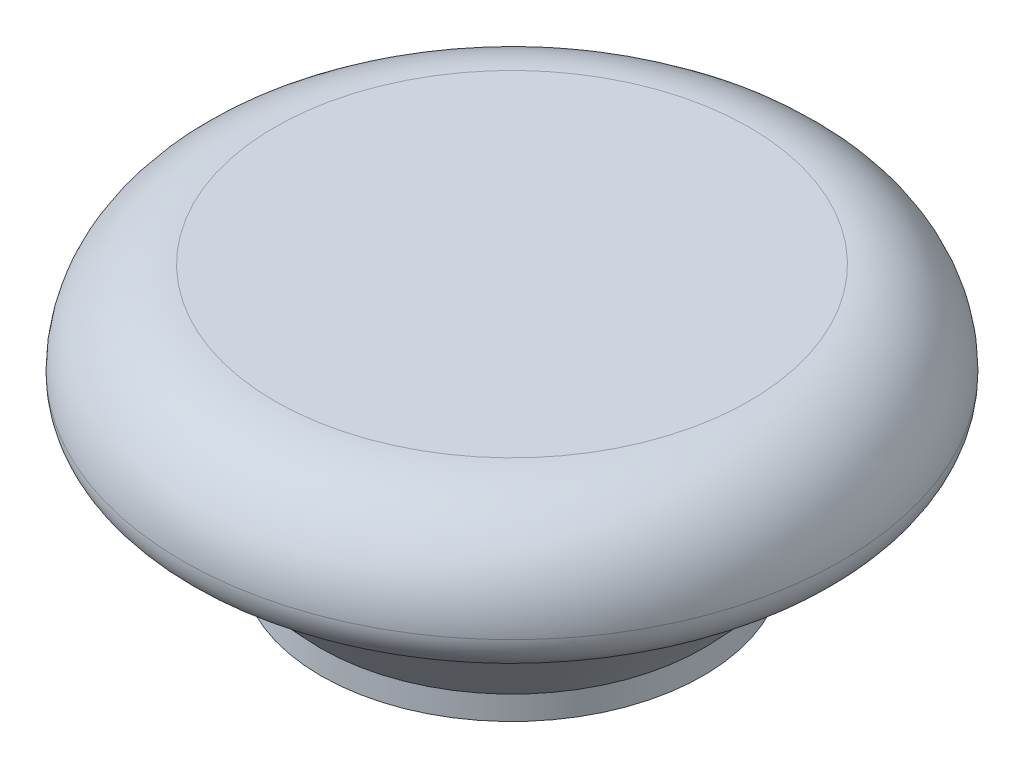
ISO-10303-21;
HEADER;
FILE_DESCRIPTION(('STEP AP214'),'2;1');
FILE_NAME('part.step','',(''),(''),'','','');
FILE_SCHEMA(('AUTOMOTIVE_DESIGN { 1 0 10303 214 1 1 1 1 }'));
ENDSEC;
DATA;
#1=APPLICATION_CONTEXT('core data for automotive mechanical design processes');
#2=APPLICATION_PROTOCOL_DEFINITION('international standard','automotive_design',2000,#1);
#3=PRODUCT_CONTEXT('',#1,'mechanical');
#4=PRODUCT('Part','Part','',(#3));
#5=PRODUCT_RELATED_PRODUCT_CATEGORY('part','',(#4));
#6=PRODUCT_DEFINITION_FORMATION('','',#4);
#7=PRODUCT_DEFINITION_CONTEXT('part definition',#1,'design');
#8=PRODUCT_DEFINITION('design','',#6,#7);
#9=PRODUCT_DEFINITION_SHAPE('','',#8);
#10=(LENGTH_UNIT() NAMED_UNIT(*) SI_UNIT(.MILLI.,.METRE.));
#11=(NAMED_UNIT(*) PLANE_ANGLE_UNIT() SI_UNIT($,.RADIAN.));
#12=(NAMED_UNIT(*) SI_UNIT($,.STERADIAN.) SOLID_ANGLE_UNIT());
#13=UNCERTAINTY_MEASURE_WITH_UNIT(LENGTH_MEASURE(1.E-05),#10,'distance_accuracy_value','');
#14=(GEOMETRIC_REPRESENTATION_CONTEXT(3) GLOBAL_UNCERTAINTY_ASSIGNED_CONTEXT((#13)) GLOBAL_UNIT_ASSIGNED_CONTEXT((#10,
#11,#12)) REPRESENTATION_CONTEXT('',''));
#15=CARTESIAN_POINT('',(0.,0.,0.));
#16=DIRECTION('',(0.,0.,1.));
#17=DIRECTION('',(1.,0.,0.));
#18=AXIS2_PLACEMENT_3D('',#15,#16,#17);
#19=CARTESIAN_POINT('',(0.,0.,0.));
#20=DIRECTION('',(0.,1.,0.));
#21=DIRECTION('',(0.,0.,1.));
#22=AXIS2_PLACEMENT_3D('',#19,#20,#21);
#23=PLANE('',#22);
#24=CARTESIAN_POINT('',(0.,0.,0.));
#25=DIRECTION('',(0.,1.,0.));
#26=DIRECTION('',(0.,0.,1.));
#27=AXIS2_PLACEMENT_3D('',#24,#25,#26);
#28=CIRCLE('',#27,2.4);
#29=CARTESIAN_POINT('',(0.,0.,2.4));
#30=VERTEX_POINT('',#29);
#31=EDGE_CURVE('E44',#30,#30,#28,.T.);
#32=ORIENTED_EDGE('',*,*,#31,.T.);
#33=EDGE_LOOP('',(#32));
#34=FACE_BOUND('',#33,.T.);
#35=CARTESIAN_POINT('',(0.,0.,0.));
#36=DIRECTION('',(0.,1.,0.));
#37=DIRECTION('',(0.,0.,1.));
#38=AXIS2_PLACEMENT_3D('',#35,#36,#37);
#39=CIRCLE('',#38,2.72188470506255);
#40=CARTESIAN_POINT('',(0.,0.,2.72188470506255));
#41=VERTEX_POINT('',#40);
#42=EDGE_CURVE('E53',#41,#41,#39,.F.);
#43=ORIENTED_EDGE('',*,*,#42,.T.);
#44=EDGE_LOOP('',(#43));
#45=FACE_BOUND('',#44,.T.);
#46=ADVANCED_FACE('F37',(#34,#45),#23,.F.);
#47=CARTESIAN_POINT('',(0.,0.,0.));
#48=DIRECTION('',(0.,1.,0.));
#49=DIRECTION('',(0.,0.,1.));
#50=AXIS2_PLACEMENT_3D('',#47,#48,#49);
#51=CONICAL_SURFACE('',#50,3.,0.463647609000806);
#52=CARTESIAN_POINT('',(0.,0.248753882025019,0.));
#53=DIRECTION('',(0.,1.,0.));
#54=DIRECTION('',(0.,0.,1.));
#55=AXIS2_PLACEMENT_3D('',#52,#53,#54);
#56=CIRCLE('',#55,3.12437694101251);
#57=CARTESIAN_POINT('',(0.,0.248753882025019,3.12437694101251));
#58=VERTEX_POINT('',#57);
#59=EDGE_CURVE('E157',#58,#58,#56,.T.);
#60=ORIENTED_EDGE('',*,*,#59,.T.);
#61=EDGE_LOOP('',(#60));
#62=FACE_BOUND('',#61,.T.);
#63=CARTESIAN_POINT('',(0.,8.,0.));
#64=DIRECTION('',(0.,1.,0.));
#65=DIRECTION('',(0.,0.,1.));
#66=AXIS2_PLACEMENT_3D('',#63,#64,#65);
#67=CIRCLE('',#66,7.);
#68=CARTESIAN_POINT('',(0.,8.,7.));
#69=VERTEX_POINT('',#68);
#70=EDGE_CURVE('E107',#69,#69,#67,.T.);
#71=ORIENTED_EDGE('',*,*,#70,.F.);
#72=EDGE_LOOP('',(#71));
#73=FACE_BOUND('',#72,.T.);
#74=ADVANCED_FACE('F125',(#62,#73),#51,.T.);
#75=CARTESIAN_POINT('',(0.,13.6568542494924,0.));
#76=DIRECTION('',(0.,-1.,0.));
#77=DIRECTION('',(0.,0.,-1.));
#78=AXIS2_PLACEMENT_3D('',#75,#76,#77);
#79=CYLINDRICAL_SURFACE('',#78,2.);
#80=CARTESIAN_POINT('',(0.,0.399999999999999,0.));
#81=DIRECTION('',(0.,1.,0.));
#82=DIRECTION('',(0.,0.,1.));
#83=AXIS2_PLACEMENT_3D('',#80,#81,#82);
#84=CIRCLE('',#83,2.);
#85=CARTESIAN_POINT('',(0.,0.399999999999999,2.));
#86=VERTEX_POINT('',#85);
#87=EDGE_CURVE('E48',#86,#86,#84,.F.);
#88=ORIENTED_EDGE('',*,*,#87,.T.);
#89=EDGE_LOOP('',(#88));
#90=FACE_BOUND('',#89,.T.);
#91=CARTESIAN_POINT('',(0.,8.,0.));
#92=DIRECTION('',(0.,1.,0.));
#93=DIRECTION('',(0.,0.,1.));
#94=AXIS2_PLACEMENT_3D('',#91,#92,#93);
#95=CIRCLE('',#94,2.);
#96=CARTESIAN_POINT('',(0.,8.,2.));
#97=VERTEX_POINT('',#96);
#98=EDGE_CURVE('E60',#97,#97,#95,.F.);
#99=ORIENTED_EDGE('',*,*,#98,.F.);
#100=EDGE_LOOP('',(#99));
#101=FACE_BOUND('',#100,.T.);
#102=ADVANCED_FACE('F135',(#90,#101),#79,.F.);
#103=CARTESIAN_POINT('',(0.,0.45,0.));
#104=DIRECTION('',(0.,1.,0.));
#105=DIRECTION('',(0.,0.,1.));
#106=AXIS2_PLACEMENT_3D('',#103,#104,#105);
#107=TOROIDAL_SURFACE('',#106,2.72188470506255,0.45);
#108=ORIENTED_EDGE('',*,*,#42,.F.);
#109=EDGE_LOOP('',(#108));
#110=FACE_BOUND('',#109,.T.);
#111=ORIENTED_EDGE('',*,*,#59,.F.);
#112=EDGE_LOOP('',(#111));
#113=FACE_BOUND('',#112,.T.);
#114=ADVANCED_FACE('F138',(#110,#113),#107,.T.);
#115=CARTESIAN_POINT('',(0.,0.399999999999999,0.));
#116=DIRECTION('',(0.,1.,0.));
#117=DIRECTION('',(0.,0.,1.));
#118=AXIS2_PLACEMENT_3D('',#115,#116,#117);
#119=TOROIDAL_SURFACE('',#118,2.4,0.4);
#120=ORIENTED_EDGE('',*,*,#31,.F.);
#121=EDGE_LOOP('',(#120));
#122=FACE_BOUND('',#121,.T.);
#123=ORIENTED_EDGE('',*,*,#87,.F.);
#124=EDGE_LOOP('',(#123));
#125=FACE_BOUND('',#124,.T.);
#126=ADVANCED_FACE('F140',(#122,#125),#119,.T.);
#127=CARTESIAN_POINT('',(0.,9.8,0.));
#128=DIRECTION('',(0.,-1.,0.));
#129=DIRECTION('',(0.,0.,-1.));
#130=AXIS2_PLACEMENT_3D('',#127,#128,#129);
#131=CYLINDRICAL_SURFACE('',#130,14.5);
#132=CARTESIAN_POINT('',(0.,9.8,0.));
#133=DIRECTION('',(0.,1.,0.));
#134=DIRECTION('',(0.,0.,1.));
#135=AXIS2_PLACEMENT_3D('',#132,#133,#134);
#136=CIRCLE('',#135,14.5);
#137=CARTESIAN_POINT('',(0.,9.8,14.5));
#138=VERTEX_POINT('',#137);
#139=EDGE_CURVE('E57',#138,#138,#136,.T.);
#140=ORIENTED_EDGE('',*,*,#139,.F.);
#141=EDGE_LOOP('',(#140));
#142=FACE_BOUND('',#141,.T.);
#143=CARTESIAN_POINT('',(0.,8.,0.));
#144=DIRECTION('',(0.,1.,0.));
#145=DIRECTION('',(0.,0.,1.));
#146=AXIS2_PLACEMENT_3D('',#143,#144,#145);
#147=CIRCLE('',#146,14.5);
#148=CARTESIAN_POINT('',(0.,8.,14.5));
#149=VERTEX_POINT('',#148);
#150=EDGE_CURVE('E61',#149,#149,#147,.T.);
#151=ORIENTED_EDGE('',*,*,#150,.T.);
#152=EDGE_LOOP('',(#151));
#153=FACE_BOUND('',#152,.T.);
#154=ADVANCED_FACE('F143',(#142,#153),#131,.T.);
#155=CARTESIAN_POINT('',(0.,8.,0.));
#156=DIRECTION('',(0.,1.,0.));
#157=DIRECTION('',(0.,0.,1.));
#158=AXIS2_PLACEMENT_3D('',#155,#156,#157);
#159=PLANE('',#158);
#160=ORIENTED_EDGE('',*,*,#150,.F.);
#161=EDGE_LOOP('',(#160));
#162=FACE_BOUND('',#161,.T.);
#163=ORIENTED_EDGE('',*,*,#70,.T.);
#164=EDGE_LOOP('',(#163));
#165=FACE_BOUND('',#164,.T.);
#166=ADVANCED_FACE('F148',(#162,#165),#159,.F.);
#167=ORIENTED_EDGE('',*,*,#98,.T.);
#168=EDGE_LOOP('',(#167));
#169=FACE_BOUND('',#168,.T.);
#170=ADVANCED_FACE('F86',(#169),#159,.F.);
#171=CARTESIAN_POINT('',(0.,9.8,0.));
#172=DIRECTION('',(0.,1.,0.));
#173=DIRECTION('',(0.,0.,1.));
#174=AXIS2_PLACEMENT_3D('',#171,#172,#173);
#175=CONICAL_SURFACE('',#174,14.5,0.753151280962195);
#176=ORIENTED_EDGE('',*,*,#139,.T.);
#177=EDGE_LOOP('',(#176));
#178=FACE_BOUND('',#177,.T.);
#179=CARTESIAN_POINT('',(0.,17.8,0.));
#180=DIRECTION('',(0.,1.,0.));
#181=DIRECTION('',(0.,0.,1.));
#182=AXIS2_PLACEMENT_3D('',#179,#180,#181);
#183=CIRCLE('',#182,22.);
#184=CARTESIAN_POINT('',(0.,17.8,22.));
#185=VERTEX_POINT('',#184);
#186=EDGE_CURVE('E66',#185,#185,#183,.F.);
#187=ORIENTED_EDGE('',*,*,#186,.T.);
#188=EDGE_LOOP('',(#187));
#189=FACE_BOUND('',#188,.T.);
#190=ADVANCED_FACE('F82',(#178,#189),#175,.T.);
#191=CARTESIAN_POINT('',(0.,20.8,0.));
#192=DIRECTION('',(0.,1.,0.));
#193=DIRECTION('',(0.,0.,1.));
#194=AXIS2_PLACEMENT_3D('',#191,#192,#193);
#195=TOROIDAL_SURFACE('',#194,22.,3.);
#196=ORIENTED_EDGE('',*,*,#186,.F.);
#197=EDGE_LOOP('',(#196));
#198=FACE_BOUND('',#197,.T.);
#199=CARTESIAN_POINT('',(0.,20.8,0.));
#200=DIRECTION('',(0.,1.,0.));
#201=DIRECTION('',(0.,0.,1.));
#202=AXIS2_PLACEMENT_3D('',#199,#200,#201);
#203=CIRCLE('',#202,25.);
#204=CARTESIAN_POINT('',(0.,20.8,25.));
#205=VERTEX_POINT('',#204);
#206=EDGE_CURVE('E239',#205,#205,#203,.T.);
#207=ORIENTED_EDGE('',*,*,#206,.F.);
#208=EDGE_LOOP('',(#207));
#209=FACE_BOUND('',#208,.T.);
#210=ADVANCED_FACE('F71',(#198,#209),#195,.T.);
#211=CARTESIAN_POINT('',(0.,27.8,0.));
#212=DIRECTION('',(0.,1.,0.));
#213=DIRECTION('',(0.,0.,1.));
#214=AXIS2_PLACEMENT_3D('',#211,#212,#213);
#215=PLANE('',#214);
#216=CARTESIAN_POINT('',(0.,27.8,0.));
#217=DIRECTION('',(0.,1.,0.));
#218=DIRECTION('',(0.,0.,1.));
#219=AXIS2_PLACEMENT_3D('',#216,#217,#218);
#220=CIRCLE('',#219,18.);
#221=CARTESIAN_POINT('',(0.,27.8,18.));
#222=VERTEX_POINT('',#221);
#223=EDGE_CURVE('E11',#222,#222,#220,.T.);
#224=ORIENTED_EDGE('',*,*,#223,.T.);
#225=EDGE_LOOP('',(#224));
#226=FACE_BOUND('',#225,.T.);
#227=ADVANCED_FACE('F81',(#226),#215,.T.);
#228=CARTESIAN_POINT('',(0.,20.8,0.));
#229=DIRECTION('',(0.,1.,0.));
#230=DIRECTION('',(0.,0.,1.));
#231=AXIS2_PLACEMENT_3D('',#228,#229,#230);
#232=TOROIDAL_SURFACE('',#231,18.,7.);
#233=ORIENTED_EDGE('',*,*,#206,.T.);
#234=EDGE_LOOP('',(#233));
#235=FACE_BOUND('',#234,.T.);
#236=ORIENTED_EDGE('',*,*,#223,.F.);
#237=EDGE_LOOP('',(#236));
#238=FACE_BOUND('',#237,.T.);
#239=ADVANCED_FACE('F39',(#235,#238),#232,.T.);
#240=CLOSED_SHELL('',(#46,#74,#102,#114,#126,#154,#166,#170,#190,#210,#227,#239));
#241=MANIFOLD_SOLID_BREP('B2',#240);
#242=ADVANCED_BREP_SHAPE_REPRESENTATION('',(#18,#241),#14);
#243=SHAPE_DEFINITION_REPRESENTATION(#9,#242);
ENDSEC;
END-ISO-10303-21;
